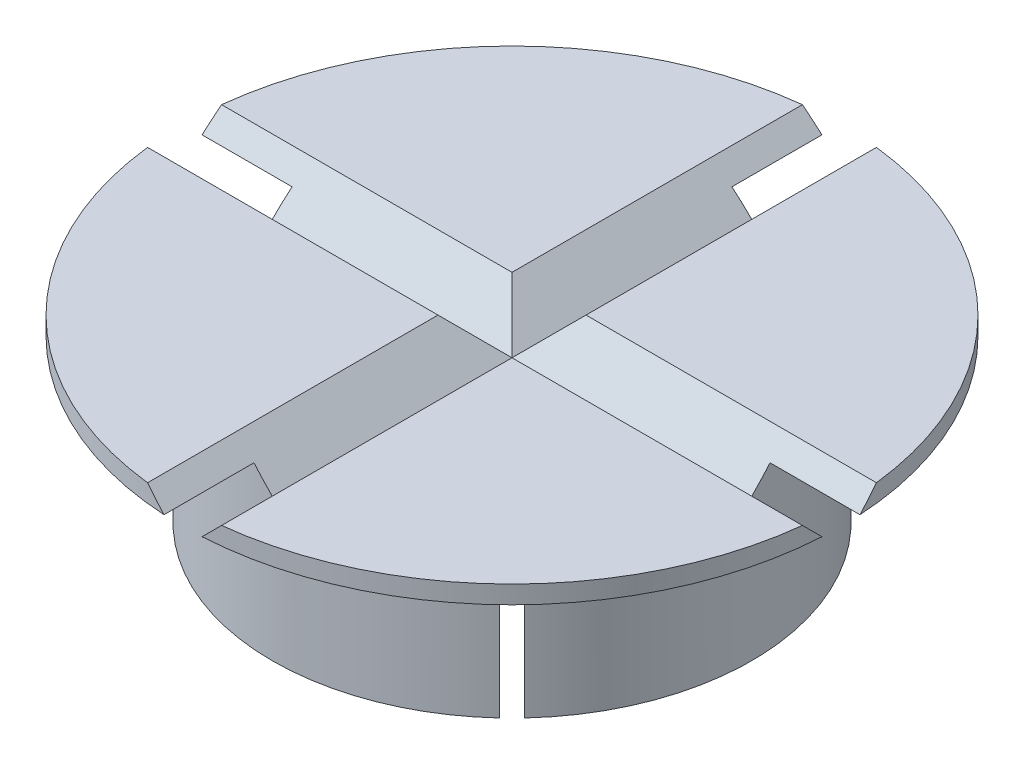
ISO-10303-21;
HEADER;
FILE_DESCRIPTION(('STEP AP214'),'2;1');
FILE_NAME('part.step','',(''),(''),'','','');
FILE_SCHEMA(('AUTOMOTIVE_DESIGN { 1 0 10303 214 1 1 1 1 }'));
ENDSEC;
DATA;
#1=APPLICATION_CONTEXT('core data for automotive mechanical design processes');
#2=APPLICATION_PROTOCOL_DEFINITION('international standard','automotive_design',2000,#1);
#3=PRODUCT_CONTEXT('',#1,'mechanical');
#4=PRODUCT('Part','Part','',(#3));
#5=PRODUCT_RELATED_PRODUCT_CATEGORY('part','',(#4));
#6=PRODUCT_DEFINITION_FORMATION('','',#4);
#7=PRODUCT_DEFINITION_CONTEXT('part definition',#1,'design');
#8=PRODUCT_DEFINITION('design','',#6,#7);
#9=PRODUCT_DEFINITION_SHAPE('','',#8);
#10=(LENGTH_UNIT() NAMED_UNIT(*) SI_UNIT(.MILLI.,.METRE.));
#11=(NAMED_UNIT(*) PLANE_ANGLE_UNIT() SI_UNIT($,.RADIAN.));
#12=(NAMED_UNIT(*) SI_UNIT($,.STERADIAN.) SOLID_ANGLE_UNIT());
#13=UNCERTAINTY_MEASURE_WITH_UNIT(LENGTH_MEASURE(1.E-05),#10,'distance_accuracy_value','');
#14=(GEOMETRIC_REPRESENTATION_CONTEXT(3) GLOBAL_UNCERTAINTY_ASSIGNED_CONTEXT((#13)) GLOBAL_UNIT_ASSIGNED_CONTEXT((#10,
#11,#12)) REPRESENTATION_CONTEXT('',''));
#15=CARTESIAN_POINT('',(0.,0.,0.));
#16=DIRECTION('',(0.,0.,1.));
#17=DIRECTION('',(1.,0.,0.));
#18=AXIS2_PLACEMENT_3D('',#15,#16,#17);
#19=CARTESIAN_POINT('',(0.,0.,0.));
#20=DIRECTION('',(0.,1.,0.));
#21=DIRECTION('',(0.,0.,1.));
#22=AXIS2_PLACEMENT_3D('',#19,#20,#21);
#23=PLANE('',#22);
#24=DIRECTION('',(-0.707106781186544,0.,0.707106781186551));
#25=VECTOR('',#24,1.);
#26=CARTESIAN_POINT('',(25.2340766922016,-3.2211462249284E-13,-26.6482902545749));
#27=LINE('',#26,#25);
#28=CARTESIAN_POINT('',(18.1593979295434,-2.36598536578077E-13,-19.5736114919167));
#29=VERTEX_POINT('',#28);
#30=CARTESIAN_POINT('',(16.0717862097112,-2.11364262460624E-13,-17.4859997720845));
#31=VERTEX_POINT('',#30);
#32=EDGE_CURVE('E266',#29,#31,#27,.T.);
#33=ORIENTED_EDGE('',*,*,#32,.T.);
#34=CARTESIAN_POINT('',(0.,0.,0.));
#35=DIRECTION('',(0.,-1.,0.));
#36=DIRECTION('',(0.,0.,-1.));
#37=AXIS2_PLACEMENT_3D('',#34,#35,#36);
#38=CIRCLE('',#37,23.75);
#39=CARTESIAN_POINT('',(-16.0717862097115,-2.02817018652179E-13,-17.4859997720841));
#40=VERTEX_POINT('',#39);
#41=EDGE_CURVE('E432',#40,#31,#38,.T.);
#42=ORIENTED_EDGE('',*,*,#41,.F.);
#43=DIRECTION('',(0.707106781186559,0.,0.707106781186536));
#44=VECTOR('',#43,1.);
#45=CARTESIAN_POINT('',(-25.2340766922021,-3.13567378684393E-13,-26.6482902545744));
#46=LINE('',#45,#44);
#47=CARTESIAN_POINT('',(-18.1593979295438,-2.28051292769631E-13,-19.5736114919163));
#48=VERTEX_POINT('',#47);
#49=EDGE_CURVE('E497',#48,#40,#46,.T.);
#50=ORIENTED_EDGE('',*,*,#49,.F.);
#51=CARTESIAN_POINT('',(0.,1.6306400674182E-13,0.));
#52=DIRECTION('',(0.,1.,0.));
#53=DIRECTION('',(0.,0.,1.));
#54=AXIS2_PLACEMENT_3D('',#51,#52,#53);
#55=CIRCLE('',#54,26.7);
#56=EDGE_CURVE('E275',#29,#48,#55,.T.);
#57=ORIENTED_EDGE('',*,*,#56,.F.);
#58=EDGE_LOOP('',(#33,#42,#50,#57));
#59=FACE_BOUND('',#58,.T.);
#60=ADVANCED_FACE('F37',(#59),#23,.F.);
#61=CARTESIAN_POINT('',(0.,20.,-1.20876281148109E-13));
#62=DIRECTION('',(0.,1.,0.));
#63=DIRECTION('',(0.,0.,1.));
#64=AXIS2_PLACEMENT_3D('',#61,#62,#63);
#65=CYLINDRICAL_SURFACE('',#64,26.6999999999999);
#66=CARTESIAN_POINT('',(0.,15.8786796564404,0.));
#67=DIRECTION('',(0.,-0.707106781186543,0.707106781186553));
#68=DIRECTION('',(0.,0.707106781186553,0.707106781186543));
#69=AXIS2_PLACEMENT_3D('',#66,#67,#68);
#70=ELLIPSE('',#69,37.7595021153616,26.6999999999999);
#71=CARTESIAN_POINT('',(-26.6155969311228,18.0000000000002,2.12132034355965));
#72=VERTEX_POINT('',#71);
#73=CARTESIAN_POINT('',(-26.6999999999999,15.8786796564405,0.));
#74=VERTEX_POINT('',#73);
#75=EDGE_CURVE('E399',#72,#74,#70,.T.);
#76=ORIENTED_EDGE('',*,*,#75,.T.);
#77=CARTESIAN_POINT('',(0.,15.8786796564404,0.));
#78=DIRECTION('',(0.,-0.707106781186551,-0.707106781186544));
#79=DIRECTION('',(0.,0.707106781186544,-0.707106781186551));
#80=AXIS2_PLACEMENT_3D('',#77,#78,#79);
#81=ELLIPSE('',#80,37.7595021153616,26.6999999999999);
#82=CARTESIAN_POINT('',(-26.6155969311228,18.0000000000002,-2.12132034355969));
#83=VERTEX_POINT('',#82);
#84=EDGE_CURVE('E392',#74,#83,#81,.T.);
#85=ORIENTED_EDGE('',*,*,#84,.T.);
#86=CARTESIAN_POINT('',(0.,18.0000000000002,-1.08788653033299E-13));
#87=DIRECTION('',(0.,1.,0.));
#88=DIRECTION('',(0.,0.,1.));
#89=AXIS2_PLACEMENT_3D('',#86,#87,#88);
#90=CIRCLE('',#89,26.6999999999999);
#91=CARTESIAN_POINT('',(-2.12132034355967,18.,-26.6155969311229));
#92=VERTEX_POINT('',#91);
#93=EDGE_CURVE('E289',#92,#83,#90,.T.);
#94=ORIENTED_EDGE('',*,*,#93,.F.);
#95=CARTESIAN_POINT('',(0.,15.8786796564404,0.));
#96=DIRECTION('',(-0.707106781186548,-0.707106781186547,0.));
#97=DIRECTION('',(-0.707106781186547,0.707106781186548,0.));
#98=AXIS2_PLACEMENT_3D('',#95,#96,#97);
#99=ELLIPSE('',#98,37.7595021153616,26.6999999999999);
#100=CARTESIAN_POINT('',(0.,15.8786796564404,-26.7));
#101=VERTEX_POINT('',#100);
#102=EDGE_CURVE('E360',#92,#101,#99,.T.);
#103=ORIENTED_EDGE('',*,*,#102,.T.);
#104=CARTESIAN_POINT('',(0.,15.8786796564404,0.));
#105=DIRECTION('',(0.707106781186548,-0.707106781186547,0.));
#106=DIRECTION('',(0.707106781186547,0.707106781186548,0.));
#107=AXIS2_PLACEMENT_3D('',#104,#105,#106);
#108=ELLIPSE('',#107,37.7595021153616,26.6999999999999);
#109=CARTESIAN_POINT('',(2.12132034355967,18.,-26.6155969311229));
#110=VERTEX_POINT('',#109);
#111=EDGE_CURVE('E344',#101,#110,#108,.T.);
#112=ORIENTED_EDGE('',*,*,#111,.T.);
#113=CARTESIAN_POINT('',(26.6155969311228,18.0000000000002,-2.12132034356019));
#114=VERTEX_POINT('',#113);
#115=EDGE_CURVE('E288',#114,#110,#90,.T.);
#116=ORIENTED_EDGE('',*,*,#115,.F.);
#117=CARTESIAN_POINT('',(0.,15.8786796564404,0.));
#118=DIRECTION('',(0.,-0.707106781186551,-0.707106781186544));
#119=DIRECTION('',(0.,0.707106781186544,-0.707106781186551));
#120=AXIS2_PLACEMENT_3D('',#117,#118,#119);
#121=ELLIPSE('',#120,37.7595021153616,26.6999999999999);
#122=CARTESIAN_POINT('',(26.6999999999999,15.8786796564402,-1.89190339067742E-13));
#123=VERTEX_POINT('',#122);
#124=EDGE_CURVE('E374',#114,#123,#121,.T.);
#125=ORIENTED_EDGE('',*,*,#124,.T.);
#126=CARTESIAN_POINT('',(0.,15.8786796564404,0.));
#127=DIRECTION('',(0.,-0.707106781186543,0.707106781186553));
#128=DIRECTION('',(0.,0.707106781186553,0.707106781186543));
#129=AXIS2_PLACEMENT_3D('',#126,#127,#128);
#130=ELLIPSE('',#129,37.7595021153616,26.6999999999999);
#131=CARTESIAN_POINT('',(26.6155969311228,18.0000000000002,2.12132034355979));
#132=VERTEX_POINT('',#131);
#133=EDGE_CURVE('E383',#123,#132,#130,.T.);
#134=ORIENTED_EDGE('',*,*,#133,.T.);
#135=CARTESIAN_POINT('',(2.12132034355999,18.0000000000003,26.6155969311227));
#136=VERTEX_POINT('',#135);
#137=EDGE_CURVE('E282',#136,#132,#90,.T.);
#138=ORIENTED_EDGE('',*,*,#137,.F.);
#139=CARTESIAN_POINT('',(0.,15.8786796564404,26.6999999999998));
#140=VERTEX_POINT('',#139);
#141=EDGE_CURVE('E336',#136,#140,#108,.T.);
#142=ORIENTED_EDGE('',*,*,#141,.T.);
#143=CARTESIAN_POINT('',(-2.12132034355999,18.0000000000003,26.6155969311227));
#144=VERTEX_POINT('',#143);
#145=EDGE_CURVE('E362',#140,#144,#99,.T.);
#146=ORIENTED_EDGE('',*,*,#145,.T.);
#147=EDGE_CURVE('E294',#72,#144,#90,.T.);
#148=ORIENTED_EDGE('',*,*,#147,.F.);
#149=EDGE_LOOP('',(#76,#85,#94,#103,#112,#116,#125,#134,#138,#142,#146,#148));
#150=FACE_BOUND('',#149,.T.);
#151=DIRECTION('',(0.,1.,0.));
#152=VECTOR('',#151,1.);
#153=CARTESIAN_POINT('',(18.1593979295433,19.9999999999999,-19.5736114919169));
#154=LINE('',#153,#152);
#155=CARTESIAN_POINT('',(18.1593979295434,11.9999999999998,-19.5736114919168));
#156=VERTEX_POINT('',#155);
#157=EDGE_CURVE('E503',#29,#156,#154,.T.);
#158=ORIENTED_EDGE('',*,*,#157,.F.);
#159=ORIENTED_EDGE('',*,*,#56,.T.);
#160=DIRECTION('',(0.,1.,0.));
#161=VECTOR('',#160,1.);
#162=CARTESIAN_POINT('',(-18.1593979295439,19.9999999999999,-19.5736114919164));
#163=LINE('',#162,#161);
#164=CARTESIAN_POINT('',(-18.1593979295438,11.9999999999998,-19.5736114919163));
#165=VERTEX_POINT('',#164);
#166=EDGE_CURVE('E468',#48,#165,#163,.T.);
#167=ORIENTED_EDGE('',*,*,#166,.T.);
#168=CARTESIAN_POINT('',(0.,12.,0.));
#169=DIRECTION('',(0.,-1.,0.));
#170=DIRECTION('',(1.,0.,0.));
#171=AXIS2_PLACEMENT_3D('',#168,#169,#170);
#172=CIRCLE('',#171,26.6999999999999);
#173=CARTESIAN_POINT('',(-19.5736114919169,11.9999999999998,-18.1593979295432));
#174=VERTEX_POINT('',#173);
#175=EDGE_CURVE('E457',#174,#165,#172,.T.);
#176=ORIENTED_EDGE('',*,*,#175,.F.);
#177=DIRECTION('',(0.,1.,0.));
#178=VECTOR('',#177,1.);
#179=CARTESIAN_POINT('',(-19.5736114919169,19.9999999999999,-18.1593979295432));
#180=LINE('',#179,#178);
#181=CARTESIAN_POINT('',(-19.5736114919169,-2.28051292769631E-13,-18.1593979295432));
#182=VERTEX_POINT('',#181);
#183=EDGE_CURVE('E464',#182,#174,#180,.T.);
#184=ORIENTED_EDGE('',*,*,#183,.F.);
#185=CARTESIAN_POINT('',(-19.5736114919165,0.,18.1593979295436));
#186=VERTEX_POINT('',#185);
#187=EDGE_CURVE('E277',#182,#186,#55,.T.);
#188=ORIENTED_EDGE('',*,*,#187,.T.);
#189=DIRECTION('',(0.,1.,0.));
#190=VECTOR('',#189,1.);
#191=CARTESIAN_POINT('',(-19.5736114919164,20.0000000000001,18.1593979295435));
#192=LINE('',#191,#190);
#193=CARTESIAN_POINT('',(-19.5736114919165,12.,18.1593979295436));
#194=VERTEX_POINT('',#193);
#195=EDGE_CURVE('E445',#186,#194,#192,.T.);
#196=ORIENTED_EDGE('',*,*,#195,.T.);
#197=CARTESIAN_POINT('',(0.,12.,0.));
#198=DIRECTION('',(0.,-1.,0.));
#199=DIRECTION('',(0.,0.,-1.));
#200=AXIS2_PLACEMENT_3D('',#197,#198,#199);
#201=CIRCLE('',#200,26.6999999999999);
#202=CARTESIAN_POINT('',(-18.1593979295434,12.,19.5736114919166));
#203=VERTEX_POINT('',#202);
#204=EDGE_CURVE('E437',#203,#194,#201,.T.);
#205=ORIENTED_EDGE('',*,*,#204,.F.);
#206=DIRECTION('',(0.,1.,0.));
#207=VECTOR('',#206,1.);
#208=CARTESIAN_POINT('',(-18.1593979295433,20.0000000000001,19.5736114919166));
#209=LINE('',#208,#207);
#210=CARTESIAN_POINT('',(-18.1593979295434,0.,19.5736114919167));
#211=VERTEX_POINT('',#210);
#212=EDGE_CURVE('E440',#211,#203,#209,.T.);
#213=ORIENTED_EDGE('',*,*,#212,.F.);
#214=CARTESIAN_POINT('',(18.1593979295437,0.,19.5736114919164));
#215=VERTEX_POINT('',#214);
#216=EDGE_CURVE('E274',#211,#215,#55,.T.);
#217=ORIENTED_EDGE('',*,*,#216,.T.);
#218=DIRECTION('',(0.,1.,0.));
#219=VECTOR('',#218,1.);
#220=CARTESIAN_POINT('',(18.1593979295437,20.0000000000001,19.5736114919162));
#221=LINE('',#220,#219);
#222=CARTESIAN_POINT('',(18.1593979295437,12.,19.5736114919163));
#223=VERTEX_POINT('',#222);
#224=EDGE_CURVE('E478',#215,#223,#221,.T.);
#225=ORIENTED_EDGE('',*,*,#224,.T.);
#226=CARTESIAN_POINT('',(0.,12.,0.));
#227=DIRECTION('',(0.,-1.,0.));
#228=DIRECTION('',(0.,0.,-1.));
#229=AXIS2_PLACEMENT_3D('',#226,#227,#228);
#230=CIRCLE('',#229,26.6999999999999);
#231=CARTESIAN_POINT('',(19.5736114919168,12.,18.1593979295432));
#232=VERTEX_POINT('',#231);
#233=EDGE_CURVE('E462',#232,#223,#230,.T.);
#234=ORIENTED_EDGE('',*,*,#233,.F.);
#235=DIRECTION('',(0.,1.,0.));
#236=VECTOR('',#235,1.);
#237=CARTESIAN_POINT('',(19.5736114919168,20.0000000000001,18.1593979295431));
#238=LINE('',#237,#236);
#239=CARTESIAN_POINT('',(19.5736114919167,0.,18.1593979295433));
#240=VERTEX_POINT('',#239);
#241=EDGE_CURVE('E273',#240,#232,#238,.T.);
#242=ORIENTED_EDGE('',*,*,#241,.F.);
#243=CARTESIAN_POINT('',(19.5736114919165,-2.19504048961189E-13,-18.1593979295436));
#244=VERTEX_POINT('',#243);
#245=EDGE_CURVE('E264',#240,#244,#55,.T.);
#246=ORIENTED_EDGE('',*,*,#245,.T.);
#247=DIRECTION('',(0.,1.,0.));
#248=VECTOR('',#247,1.);
#249=CARTESIAN_POINT('',(19.5736114919164,19.9999999999999,-18.1593979295438));
#250=LINE('',#249,#248);
#251=CARTESIAN_POINT('',(19.5736114919165,11.9999999999998,-18.1593979295437));
#252=VERTEX_POINT('',#251);
#253=EDGE_CURVE('E248',#244,#252,#250,.T.);
#254=ORIENTED_EDGE('',*,*,#253,.T.);
#255=CARTESIAN_POINT('',(0.,12.,0.));
#256=DIRECTION('',(0.,-1.,0.));
#257=DIRECTION('',(0.,0.,-1.));
#258=AXIS2_PLACEMENT_3D('',#255,#256,#257);
#259=CIRCLE('',#258,26.6999999999999);
#260=EDGE_CURVE('E499',#156,#252,#259,.T.);
#261=ORIENTED_EDGE('',*,*,#260,.F.);
#262=EDGE_LOOP('',(#158,#159,#167,#176,#184,#188,#196,#205,#213,#217,#225,#234,#242,#246,#254,#261));
#263=FACE_BOUND('',#262,.T.);
#264=ADVANCED_FACE('F271',(#150,#263),#65,.T.);
#265=CARTESIAN_POINT('',(0.,12.,0.));
#266=DIRECTION('',(0.,-1.,0.));
#267=DIRECTION('',(0.,0.,-1.));
#268=AXIS2_PLACEMENT_3D('',#265,#266,#267);
#269=CYLINDRICAL_SURFACE('',#268,23.75);
#270=DIRECTION('',(0.,-1.,0.));
#271=VECTOR('',#270,1.);
#272=CARTESIAN_POINT('',(16.0717862097112,11.9999999999999,-17.4859997720846));
#273=LINE('',#272,#271);
#274=CARTESIAN_POINT('',(16.0717862097112,11.9999999999998,-17.4859997720846));
#275=VERTEX_POINT('',#274);
#276=EDGE_CURVE('E256',#275,#31,#273,.T.);
#277=ORIENTED_EDGE('',*,*,#276,.F.);
#278=CARTESIAN_POINT('',(0.,12.,0.));
#279=DIRECTION('',(0.,-1.,0.));
#280=DIRECTION('',(0.,0.,-1.));
#281=AXIS2_PLACEMENT_3D('',#278,#279,#280);
#282=CIRCLE('',#281,23.75);
#283=CARTESIAN_POINT('',(-16.0717862097116,11.9999999999999,-17.4859997720842));
#284=VERTEX_POINT('',#283);
#285=EDGE_CURVE('E435',#284,#275,#282,.T.);
#286=ORIENTED_EDGE('',*,*,#285,.F.);
#287=DIRECTION('',(0.,-1.,0.));
#288=VECTOR('',#287,1.);
#289=CARTESIAN_POINT('',(-16.0717862097116,11.9999999999999,-17.4859997720842));
#290=LINE('',#289,#288);
#291=EDGE_CURVE('E471',#284,#40,#290,.T.);
#292=ORIENTED_EDGE('',*,*,#291,.T.);
#293=ORIENTED_EDGE('',*,*,#41,.T.);
#294=EDGE_LOOP('',(#277,#286,#292,#293));
#295=FACE_BOUND('',#294,.T.);
#296=ADVANCED_FACE('F541',(#295),#269,.F.);
#297=DIRECTION('',(0.707106781186559,0.,0.707106781186536));
#298=VECTOR('',#297,1.);
#299=CARTESIAN_POINT('',(-26.6482902545752,-3.13567378684393E-13,-25.2340766922013));
#300=LINE('',#299,#298);
#301=CARTESIAN_POINT('',(-17.4859997720846,-2.02817018652178E-13,-16.071786209711));
#302=VERTEX_POINT('',#301);
#303=EDGE_CURVE('E493',#182,#302,#300,.T.);
#304=ORIENTED_EDGE('',*,*,#303,.T.);
#305=CARTESIAN_POINT('',(-17.4859997720843,0.,16.0717862097114));
#306=VERTEX_POINT('',#305);
#307=EDGE_CURVE('E428',#306,#302,#38,.T.);
#308=ORIENTED_EDGE('',*,*,#307,.F.);
#309=DIRECTION('',(0.707106781186544,0.,-0.707106781186551));
#310=VECTOR('',#309,1.);
#311=CARTESIAN_POINT('',(-26.6482902545747,0.,25.2340766922018));
#312=LINE('',#311,#310);
#313=EDGE_CURVE('E455',#186,#306,#312,.T.);
#314=ORIENTED_EDGE('',*,*,#313,.F.);
#315=ORIENTED_EDGE('',*,*,#187,.F.);
#316=EDGE_LOOP('',(#304,#308,#314,#315));
#317=FACE_BOUND('',#316,.T.);
#318=ADVANCED_FACE('F536',(#317),#23,.F.);
#319=CARTESIAN_POINT('',(17.4859997720843,-1.94269774843737E-13,-16.0717862097114));
#320=VERTEX_POINT('',#319);
#321=CARTESIAN_POINT('',(17.4859997720845,0.,16.0717862097111));
#322=VERTEX_POINT('',#321);
#323=EDGE_CURVE('E265',#320,#322,#38,.T.);
#324=ORIENTED_EDGE('',*,*,#323,.F.);
#325=DIRECTION('',(-0.707106781186544,0.,0.707106781186551));
#326=VECTOR('',#325,1.);
#327=CARTESIAN_POINT('',(26.6482902545747,-3.05020134875953E-13,-25.2340766922018));
#328=LINE('',#327,#326);
#329=EDGE_CURVE('E251',#244,#320,#328,.T.);
#330=ORIENTED_EDGE('',*,*,#329,.F.);
#331=ORIENTED_EDGE('',*,*,#245,.F.);
#332=DIRECTION('',(-0.707106781186554,0.,-0.707106781186541));
#333=VECTOR('',#332,1.);
#334=CARTESIAN_POINT('',(26.648290254575,0.,25.2340766922015));
#335=LINE('',#334,#333);
#336=EDGE_CURVE('E485',#240,#322,#335,.T.);
#337=ORIENTED_EDGE('',*,*,#336,.T.);
#338=EDGE_LOOP('',(#324,#330,#331,#337));
#339=FACE_BOUND('',#338,.T.);
#340=ADVANCED_FACE('F262',(#339),#23,.F.);
#341=DIRECTION('',(0.,-1.,0.));
#342=VECTOR('',#341,1.);
#343=CARTESIAN_POINT('',(-17.4859997720846,11.9999999999999,-16.071786209711));
#344=LINE('',#343,#342);
#345=CARTESIAN_POINT('',(-17.4859997720847,11.9999999999998,-16.071786209711));
#346=VERTEX_POINT('',#345);
#347=EDGE_CURVE('E466',#346,#302,#344,.T.);
#348=ORIENTED_EDGE('',*,*,#347,.F.);
#349=CARTESIAN_POINT('',(-17.4859997720843,12.0000000000001,16.0717862097113));
#350=VERTEX_POINT('',#349);
#351=EDGE_CURVE('E427',#350,#346,#282,.T.);
#352=ORIENTED_EDGE('',*,*,#351,.F.);
#353=DIRECTION('',(0.,-1.,0.));
#354=VECTOR('',#353,1.);
#355=CARTESIAN_POINT('',(-17.4859997720843,12.0000000000001,16.0717862097113));
#356=LINE('',#355,#354);
#357=EDGE_CURVE('E447',#350,#306,#356,.T.);
#358=ORIENTED_EDGE('',*,*,#357,.T.);
#359=ORIENTED_EDGE('',*,*,#307,.T.);
#360=EDGE_LOOP('',(#348,#352,#358,#359));
#361=FACE_BOUND('',#360,.T.);
#362=ADVANCED_FACE('F556',(#361),#269,.F.);
#363=CARTESIAN_POINT('',(17.4859997720843,11.9999999999999,-16.0717862097115));
#364=VERTEX_POINT('',#363);
#365=CARTESIAN_POINT('',(17.4859997720845,12.,16.071786209711));
#366=VERTEX_POINT('',#365);
#367=EDGE_CURVE('E436',#364,#366,#282,.T.);
#368=ORIENTED_EDGE('',*,*,#367,.F.);
#369=DIRECTION('',(0.,-1.,0.));
#370=VECTOR('',#369,1.);
#371=CARTESIAN_POINT('',(17.4859997720843,11.9999999999999,-16.0717862097115));
#372=LINE('',#371,#370);
#373=EDGE_CURVE('E257',#364,#320,#372,.T.);
#374=ORIENTED_EDGE('',*,*,#373,.T.);
#375=ORIENTED_EDGE('',*,*,#323,.T.);
#376=DIRECTION('',(0.,-1.,0.));
#377=VECTOR('',#376,1.);
#378=CARTESIAN_POINT('',(17.4859997720845,12.0000000000001,16.071786209711));
#379=LINE('',#378,#377);
#380=EDGE_CURVE('E475',#366,#322,#379,.T.);
#381=ORIENTED_EDGE('',*,*,#380,.F.);
#382=EDGE_LOOP('',(#368,#374,#375,#381));
#383=FACE_BOUND('',#382,.T.);
#384=ADVANCED_FACE('F547',(#383),#269,.F.);
#385=CARTESIAN_POINT('',(16.0717862097114,0.,17.4859997720842));
#386=VERTEX_POINT('',#385);
#387=CARTESIAN_POINT('',(-16.0717862097112,0.,17.4859997720845));
#388=VERTEX_POINT('',#387);
#389=EDGE_CURVE('E439',#386,#388,#38,.T.);
#390=ORIENTED_EDGE('',*,*,#389,.F.);
#391=DIRECTION('',(-0.707106781186554,0.,-0.707106781186541));
#392=VECTOR('',#391,1.);
#393=CARTESIAN_POINT('',(25.2340766922019,0.,26.6482902545746));
#394=LINE('',#393,#392);
#395=EDGE_CURVE('E487',#215,#386,#394,.T.);
#396=ORIENTED_EDGE('',*,*,#395,.F.);
#397=ORIENTED_EDGE('',*,*,#216,.F.);
#398=DIRECTION('',(0.707106781186544,0.,-0.707106781186551));
#399=VECTOR('',#398,1.);
#400=CARTESIAN_POINT('',(-25.2340766922016,0.,26.6482902545749));
#401=LINE('',#400,#399);
#402=EDGE_CURVE('E451',#211,#388,#401,.T.);
#403=ORIENTED_EDGE('',*,*,#402,.T.);
#404=EDGE_LOOP('',(#390,#396,#397,#403));
#405=FACE_BOUND('',#404,.T.);
#406=ADVANCED_FACE('F537',(#405),#23,.F.);
#407=CARTESIAN_POINT('',(16.0717862097115,12.0000000000001,17.4859997720841));
#408=VERTEX_POINT('',#407);
#409=CARTESIAN_POINT('',(-16.0717862097112,12.,17.4859997720844));
#410=VERTEX_POINT('',#409);
#411=EDGE_CURVE('E431',#408,#410,#282,.T.);
#412=ORIENTED_EDGE('',*,*,#411,.F.);
#413=DIRECTION('',(0.,-1.,0.));
#414=VECTOR('',#413,1.);
#415=CARTESIAN_POINT('',(16.0717862097115,12.0000000000001,17.4859997720841));
#416=LINE('',#415,#414);
#417=EDGE_CURVE('E481',#408,#386,#416,.T.);
#418=ORIENTED_EDGE('',*,*,#417,.T.);
#419=ORIENTED_EDGE('',*,*,#389,.T.);
#420=DIRECTION('',(0.,-1.,0.));
#421=VECTOR('',#420,1.);
#422=CARTESIAN_POINT('',(-16.0717862097112,12.0000000000001,17.4859997720844));
#423=LINE('',#422,#421);
#424=EDGE_CURVE('E442',#410,#388,#423,.T.);
#425=ORIENTED_EDGE('',*,*,#424,.F.);
#426=EDGE_LOOP('',(#412,#418,#419,#425));
#427=FACE_BOUND('',#426,.T.);
#428=ADVANCED_FACE('F546',(#427),#269,.F.);
#429=CARTESIAN_POINT('',(0.,18.,-26.7));
#430=DIRECTION('',(0.,1.,0.));
#431=DIRECTION('',(0.,0.,1.));
#432=AXIS2_PLACEMENT_3D('',#429,#430,#431);
#433=PLANE('',#432);
#434=CARTESIAN_POINT('',(0.,18.0000000000002,-1.08788653033299E-13));
#435=DIRECTION('',(0.,1.,0.));
#436=DIRECTION('',(0.,0.,1.));
#437=AXIS2_PLACEMENT_3D('',#434,#435,#436);
#438=CIRCLE('',#437,36.6999999999999);
#439=CARTESIAN_POINT('',(36.6386408044839,18.0000000000002,-2.12132034356032));
#440=VERTEX_POINT('',#439);
#441=CARTESIAN_POINT('',(2.12132034355964,18.,-36.638640804484));
#442=VERTEX_POINT('',#441);
#443=EDGE_CURVE('E308',#440,#442,#438,.T.);
#444=ORIENTED_EDGE('',*,*,#443,.F.);
#445=DIRECTION('',(-1.,0.,0.));
#446=VECTOR('',#445,1.);
#447=CARTESIAN_POINT('',(2.34364970973921E-13,18.0000000000002,-2.12132034355994));
#448=LINE('',#447,#446);
#449=EDGE_CURVE('E377',#440,#114,#448,.T.);
#450=ORIENTED_EDGE('',*,*,#449,.T.);
#451=ORIENTED_EDGE('',*,*,#115,.T.);
#452=DIRECTION('',(0.,0.,-1.));
#453=VECTOR('',#452,1.);
#454=CARTESIAN_POINT('',(2.12132034355967,18.,-26.7));
#455=LINE('',#454,#453);
#456=EDGE_CURVE('E349',#110,#442,#455,.T.);
#457=ORIENTED_EDGE('',*,*,#456,.T.);
#458=EDGE_LOOP('',(#444,#450,#451,#457));
#459=FACE_BOUND('',#458,.T.);
#460=ADVANCED_FACE('F553',(#459),#433,.F.);
#461=CARTESIAN_POINT('',(0.,20.,-1.20876281148109E-13));
#462=DIRECTION('',(0.,1.,0.));
#463=DIRECTION('',(0.,0.,1.));
#464=AXIS2_PLACEMENT_3D('',#461,#462,#463);
#465=CYLINDRICAL_SURFACE('',#464,36.6999999999999);
#466=CARTESIAN_POINT('',(0.,20.0000000000002,-1.2087628114811E-13));
#467=DIRECTION('',(0.,1.,0.));
#468=DIRECTION('',(0.,0.,1.));
#469=AXIS2_PLACEMENT_3D('',#466,#467,#468);
#470=CIRCLE('',#469,36.6999999999999);
#471=CARTESIAN_POINT('',(-36.4678587063424,20.0000000000002,4.12132034355964));
#472=VERTEX_POINT('',#471);
#473=CARTESIAN_POINT('',(-4.12132034355963,20.,36.4678587063422));
#474=VERTEX_POINT('',#473);
#475=EDGE_CURVE('E330',#472,#474,#470,.T.);
#476=ORIENTED_EDGE('',*,*,#475,.F.);
#477=CARTESIAN_POINT('',(0.,15.8786796564404,0.));
#478=DIRECTION('',(0.,-0.707106781186543,0.707106781186553));
#479=DIRECTION('',(0.,0.707106781186553,0.707106781186543));
#480=AXIS2_PLACEMENT_3D('',#477,#478,#479);
#481=ELLIPSE('',#480,51.9016377390925,36.6999999999999);
#482=CARTESIAN_POINT('',(-36.6386408044839,18.0000000000002,2.12132034355963));
#483=VERTEX_POINT('',#482);
#484=EDGE_CURVE('E397',#472,#483,#481,.T.);
#485=ORIENTED_EDGE('',*,*,#484,.T.);
#486=CARTESIAN_POINT('',(-2.12132034356008,18.0000000000005,36.6386408044837));
#487=VERTEX_POINT('',#486);
#488=EDGE_CURVE('E314',#483,#487,#438,.T.);
#489=ORIENTED_EDGE('',*,*,#488,.T.);
#490=CARTESIAN_POINT('',(0.,15.8786796564404,0.));
#491=DIRECTION('',(-0.707106781186548,-0.707106781186547,0.));
#492=DIRECTION('',(-0.707106781186547,0.707106781186548,0.));
#493=AXIS2_PLACEMENT_3D('',#490,#491,#492);
#494=ELLIPSE('',#493,51.9016377390925,36.6999999999999);
#495=EDGE_CURVE('E367',#487,#474,#494,.T.);
#496=ORIENTED_EDGE('',*,*,#495,.T.);
#497=EDGE_LOOP('',(#476,#485,#489,#496));
#498=FACE_BOUND('',#497,.T.);
#499=ADVANCED_FACE('F868',(#498),#465,.T.);
#500=CARTESIAN_POINT('',(0.,19.9999999999999,-36.7));
#501=DIRECTION('',(0.,-1.,0.));
#502=DIRECTION('',(0.,0.,-1.));
#503=AXIS2_PLACEMENT_3D('',#500,#501,#502);
#504=PLANE('',#503);
#505=DIRECTION('',(0.,0.,1.));
#506=VECTOR('',#505,1.);
#507=CARTESIAN_POINT('',(4.12132034355953,19.9999999999999,-36.7));
#508=LINE('',#507,#506);
#509=CARTESIAN_POINT('',(4.12132034355963,20.,-36.4678587063425));
#510=VERTEX_POINT('',#509);
#511=CARTESIAN_POINT('',(4.12132034355967,20.,-4.12132034355979));
#512=VERTEX_POINT('',#511);
#513=EDGE_CURVE('E658',#510,#512,#508,.T.);
#514=ORIENTED_EDGE('',*,*,#513,.T.);
#515=DIRECTION('',(1.,0.,0.));
#516=VECTOR('',#515,1.);
#517=CARTESIAN_POINT('',(-36.7,20.0000000000002,-4.12132034355962));
#518=LINE('',#517,#516);
#519=CARTESIAN_POINT('',(36.4678587063424,19.9999999999998,-4.12132034355988));
#520=VERTEX_POINT('',#519);
#521=EDGE_CURVE('E412',#512,#520,#518,.T.);
#522=ORIENTED_EDGE('',*,*,#521,.T.);
#523=EDGE_CURVE('E328',#520,#510,#470,.T.);
#524=ORIENTED_EDGE('',*,*,#523,.T.);
#525=EDGE_LOOP('',(#514,#522,#524));
#526=FACE_BOUND('',#525,.T.);
#527=ADVANCED_FACE('F856',(#526),#504,.F.);
#528=ORIENTED_EDGE('',*,*,#93,.T.);
#529=DIRECTION('',(-1.,0.,0.));
#530=VECTOR('',#529,1.);
#531=CARTESIAN_POINT('',(2.34364970973921E-13,18.0000000000002,-2.12132034355994));
#532=LINE('',#531,#530);
#533=CARTESIAN_POINT('',(-36.6386408044839,18.0000000000002,-2.12132034355959));
#534=VERTEX_POINT('',#533);
#535=EDGE_CURVE('E395',#83,#534,#532,.T.);
#536=ORIENTED_EDGE('',*,*,#535,.T.);
#537=CARTESIAN_POINT('',(-2.12132034355964,18.,-36.638640804484));
#538=VERTEX_POINT('',#537);
#539=EDGE_CURVE('E309',#538,#534,#438,.T.);
#540=ORIENTED_EDGE('',*,*,#539,.F.);
#541=DIRECTION('',(0.,0.,1.));
#542=VECTOR('',#541,1.);
#543=CARTESIAN_POINT('',(-2.12132034355967,18.,-26.7));
#544=LINE('',#543,#542);
#545=EDGE_CURVE('E368',#538,#92,#544,.T.);
#546=ORIENTED_EDGE('',*,*,#545,.T.);
#547=EDGE_LOOP('',(#528,#536,#540,#546));
#548=FACE_BOUND('',#547,.T.);
#549=ADVANCED_FACE('F900',(#548),#433,.F.);
#550=ORIENTED_EDGE('',*,*,#523,.F.);
#551=CARTESIAN_POINT('',(0.,15.8786796564404,0.));
#552=DIRECTION('',(0.,-0.707106781186551,-0.707106781186544));
#553=DIRECTION('',(0.,0.707106781186544,-0.707106781186551));
#554=AXIS2_PLACEMENT_3D('',#551,#552,#553);
#555=ELLIPSE('',#554,51.9016377390925,36.6999999999999);
#556=EDGE_CURVE('E380',#520,#440,#555,.T.);
#557=ORIENTED_EDGE('',*,*,#556,.T.);
#558=ORIENTED_EDGE('',*,*,#443,.T.);
#559=CARTESIAN_POINT('',(0.,15.8786796564404,0.));
#560=DIRECTION('',(0.707106781186548,-0.707106781186547,0.));
#561=DIRECTION('',(0.707106781186547,0.707106781186548,0.));
#562=AXIS2_PLACEMENT_3D('',#559,#560,#561);
#563=ELLIPSE('',#562,51.9016377390925,36.6999999999999);
#564=EDGE_CURVE('E354',#442,#510,#563,.T.);
#565=ORIENTED_EDGE('',*,*,#564,.T.);
#566=EDGE_LOOP('',(#550,#557,#558,#565));
#567=FACE_BOUND('',#566,.T.);
#568=ADVANCED_FACE('F893',(#567),#465,.T.);
#569=CARTESIAN_POINT('',(-4.12132034355953,20.,-36.4678587063425));
#570=VERTEX_POINT('',#569);
#571=CARTESIAN_POINT('',(-36.4678587063424,20.0000000000002,-4.12132034355962));
#572=VERTEX_POINT('',#571);
#573=EDGE_CURVE('E329',#570,#572,#470,.T.);
#574=ORIENTED_EDGE('',*,*,#573,.T.);
#575=CARTESIAN_POINT('',(-4.12132034355963,20.,-4.12132034355971));
#576=VERTEX_POINT('',#575);
#577=EDGE_CURVE('E404',#572,#576,#518,.T.);
#578=ORIENTED_EDGE('',*,*,#577,.T.);
#579=DIRECTION('',(0.,0.,-1.));
#580=VECTOR('',#579,1.);
#581=CARTESIAN_POINT('',(-4.12132034355953,19.9999999999999,-36.7));
#582=LINE('',#581,#580);
#583=EDGE_CURVE('E279',#576,#570,#582,.T.);
#584=ORIENTED_EDGE('',*,*,#583,.T.);
#585=EDGE_LOOP('',(#574,#578,#584));
#586=FACE_BOUND('',#585,.T.);
#587=ADVANCED_FACE('F885',(#586),#504,.F.);
#588=CARTESIAN_POINT('',(4.12132034355963,20.,-36.7));
#589=DIRECTION('',(0.707106781186548,-0.707106781186547,0.));
#590=DIRECTION('',(0.707106781186547,0.707106781186548,0.));
#591=AXIS2_PLACEMENT_3D('',#588,#589,#590);
#592=PLANE('',#591);
#593=DIRECTION('',(0.,0.,1.));
#594=VECTOR('',#593,1.);
#595=CARTESIAN_POINT('',(0.,15.8786796564404,-36.7));
#596=LINE('',#595,#594);
#597=CARTESIAN_POINT('',(0.,15.8786796564404,0.));
#598=VERTEX_POINT('',#597);
#599=EDGE_CURVE('E370',#101,#598,#596,.T.);
#600=ORIENTED_EDGE('',*,*,#599,.T.);
#601=DIRECTION('',(0.577350269189627,0.577350269189621,-0.577350269189629));
#602=VECTOR('',#601,1.);
#603=CARTESIAN_POINT('',(-12.2128802681613,3.66579938827923,12.2128802681612));
#604=LINE('',#603,#602);
#605=EDGE_CURVE('E418',#598,#512,#604,.T.);
#606=ORIENTED_EDGE('',*,*,#605,.T.);
#607=ORIENTED_EDGE('',*,*,#513,.F.);
#608=ORIENTED_EDGE('',*,*,#564,.F.);
#609=ORIENTED_EDGE('',*,*,#456,.F.);
#610=ORIENTED_EDGE('',*,*,#111,.F.);
#611=EDGE_LOOP('',(#600,#606,#607,#608,#609,#610));
#612=FACE_BOUND('',#611,.T.);
#613=ADVANCED_FACE('F845',(#612),#592,.F.);
#614=CARTESIAN_POINT('',(0.,15.8786796564404,-36.7));
#615=DIRECTION('',(-0.707106781186548,-0.707106781186547,0.));
#616=DIRECTION('',(0.707106781186547,-0.707106781186548,0.));
#617=AXIS2_PLACEMENT_3D('',#614,#615,#616);
#618=PLANE('',#617);
#619=ORIENTED_EDGE('',*,*,#583,.F.);
#620=DIRECTION('',(0.577350269189628,-0.577350269189623,0.577350269189626));
#621=VECTOR('',#620,1.);
#622=CARTESIAN_POINT('',(9.46533337245476,6.41334628398569,9.46533337245462));
#623=LINE('',#622,#621);
#624=EDGE_CURVE('E424',#576,#598,#623,.T.);
#625=ORIENTED_EDGE('',*,*,#624,.T.);
#626=ORIENTED_EDGE('',*,*,#599,.F.);
#627=ORIENTED_EDGE('',*,*,#102,.F.);
#628=ORIENTED_EDGE('',*,*,#545,.F.);
#629=EDGE_CURVE('E364',#570,#538,#494,.T.);
#630=ORIENTED_EDGE('',*,*,#629,.F.);
#631=EDGE_LOOP('',(#619,#625,#626,#627,#628,#630));
#632=FACE_BOUND('',#631,.T.);
#633=ADVANCED_FACE('F833',(#632),#618,.F.);
#634=ORIENTED_EDGE('',*,*,#137,.T.);
#635=DIRECTION('',(1.,0.,0.));
#636=VECTOR('',#635,1.);
#637=CARTESIAN_POINT('',(0.,18.0000000000002,2.12132034355972));
#638=LINE('',#637,#636);
#639=CARTESIAN_POINT('',(36.6386408044839,18.0000000000002,2.12132034355985));
#640=VERTEX_POINT('',#639);
#641=EDGE_CURVE('E386',#132,#640,#638,.T.);
#642=ORIENTED_EDGE('',*,*,#641,.T.);
#643=CARTESIAN_POINT('',(2.12132034356008,18.0000000000005,36.6386408044838));
#644=VERTEX_POINT('',#643);
#645=EDGE_CURVE('E301',#644,#640,#438,.T.);
#646=ORIENTED_EDGE('',*,*,#645,.F.);
#647=EDGE_CURVE('E343',#644,#136,#455,.T.);
#648=ORIENTED_EDGE('',*,*,#647,.T.);
#649=EDGE_LOOP('',(#634,#642,#646,#648));
#650=FACE_BOUND('',#649,.T.);
#651=ADVANCED_FACE('F878',(#650),#433,.F.);
#652=ORIENTED_EDGE('',*,*,#539,.T.);
#653=CARTESIAN_POINT('',(0.,15.8786796564404,0.));
#654=DIRECTION('',(0.,-0.707106781186551,-0.707106781186544));
#655=DIRECTION('',(0.,0.707106781186544,-0.707106781186551));
#656=AXIS2_PLACEMENT_3D('',#653,#654,#655);
#657=ELLIPSE('',#656,51.9016377390925,36.6999999999999);
#658=EDGE_CURVE('E390',#534,#572,#657,.T.);
#659=ORIENTED_EDGE('',*,*,#658,.T.);
#660=ORIENTED_EDGE('',*,*,#573,.F.);
#661=ORIENTED_EDGE('',*,*,#629,.T.);
#662=EDGE_LOOP('',(#652,#659,#660,#661));
#663=FACE_BOUND('',#662,.T.);
#664=ADVANCED_FACE('F869',(#663),#465,.T.);
#665=CARTESIAN_POINT('',(4.12132034355963,20.,36.4678587063422));
#666=VERTEX_POINT('',#665);
#667=CARTESIAN_POINT('',(36.4678587063424,19.9999999999998,4.12132034355938));
#668=VERTEX_POINT('',#667);
#669=EDGE_CURVE('E321',#666,#668,#470,.T.);
#670=ORIENTED_EDGE('',*,*,#669,.T.);
#671=DIRECTION('',(1.,0.,0.));
#672=VECTOR('',#671,1.);
#673=CARTESIAN_POINT('',(-36.7,20.0000000000002,4.12132034355964));
#674=LINE('',#673,#672);
#675=CARTESIAN_POINT('',(4.12132034355963,20.,4.1213203435595));
#676=VERTEX_POINT('',#675);
#677=EDGE_CURVE('E408',#676,#668,#674,.T.);
#678=ORIENTED_EDGE('',*,*,#677,.F.);
#679=EDGE_CURVE('E664',#676,#666,#508,.T.);
#680=ORIENTED_EDGE('',*,*,#679,.T.);
#681=EDGE_LOOP('',(#670,#678,#680));
#682=FACE_BOUND('',#681,.T.);
#683=ADVANCED_FACE('F857',(#682),#504,.F.);
#684=ORIENTED_EDGE('',*,*,#488,.F.);
#685=DIRECTION('',(1.,0.,0.));
#686=VECTOR('',#685,1.);
#687=CARTESIAN_POINT('',(0.,18.0000000000002,2.12132034355972));
#688=LINE('',#687,#686);
#689=EDGE_CURVE('E402',#483,#72,#688,.T.);
#690=ORIENTED_EDGE('',*,*,#689,.T.);
#691=ORIENTED_EDGE('',*,*,#147,.T.);
#692=EDGE_CURVE('E365',#144,#487,#544,.T.);
#693=ORIENTED_EDGE('',*,*,#692,.T.);
#694=EDGE_LOOP('',(#684,#690,#691,#693));
#695=FACE_BOUND('',#694,.T.);
#696=ADVANCED_FACE('F866',(#695),#433,.F.);
#697=ORIENTED_EDGE('',*,*,#645,.T.);
#698=CARTESIAN_POINT('',(0.,15.8786796564404,0.));
#699=DIRECTION('',(0.,-0.707106781186543,0.707106781186553));
#700=DIRECTION('',(0.,0.707106781186553,0.707106781186543));
#701=AXIS2_PLACEMENT_3D('',#698,#699,#700);
#702=ELLIPSE('',#701,51.9016377390925,36.6999999999999);
#703=EDGE_CURVE('E388',#640,#668,#702,.T.);
#704=ORIENTED_EDGE('',*,*,#703,.T.);
#705=ORIENTED_EDGE('',*,*,#669,.F.);
#706=EDGE_CURVE('E347',#666,#644,#563,.T.);
#707=ORIENTED_EDGE('',*,*,#706,.T.);
#708=EDGE_LOOP('',(#697,#704,#705,#707));
#709=FACE_BOUND('',#708,.T.);
#710=ADVANCED_FACE('F854',(#709),#465,.T.);
#711=CARTESIAN_POINT('',(-4.12132034355978,20.0000000000001,4.12132034355958));
#712=VERTEX_POINT('',#711);
#713=EDGE_CURVE('E977',#474,#712,#582,.T.);
#714=ORIENTED_EDGE('',*,*,#713,.T.);
#715=EDGE_CURVE('E405',#472,#712,#674,.T.);
#716=ORIENTED_EDGE('',*,*,#715,.F.);
#717=ORIENTED_EDGE('',*,*,#475,.T.);
#718=EDGE_LOOP('',(#714,#716,#717));
#719=FACE_BOUND('',#718,.T.);
#720=ADVANCED_FACE('F842',(#719),#504,.F.);
#721=ORIENTED_EDGE('',*,*,#679,.F.);
#722=DIRECTION('',(-0.577350269189626,-0.577350269189635,-0.577350269189617));
#723=VECTOR('',#722,1.);
#724=CARTESIAN_POINT('',(12.2128802681613,28.0915599246018,12.212880268161));
#725=LINE('',#724,#723);
#726=EDGE_CURVE('E415',#676,#598,#725,.T.);
#727=ORIENTED_EDGE('',*,*,#726,.T.);
#728=EDGE_CURVE('E373',#598,#140,#596,.T.);
#729=ORIENTED_EDGE('',*,*,#728,.T.);
#730=ORIENTED_EDGE('',*,*,#141,.F.);
#731=ORIENTED_EDGE('',*,*,#647,.F.);
#732=ORIENTED_EDGE('',*,*,#706,.F.);
#733=EDGE_LOOP('',(#721,#727,#729,#730,#731,#732));
#734=FACE_BOUND('',#733,.T.);
#735=ADVANCED_FACE('F830',(#734),#592,.F.);
#736=ORIENTED_EDGE('',*,*,#728,.F.);
#737=DIRECTION('',(-0.57735026918962,0.577350269189628,0.577350269189629));
#738=VECTOR('',#737,1.);
#739=CARTESIAN_POINT('',(-14.9604271638678,30.8391068203083,14.9604271638679));
#740=LINE('',#739,#738);
#741=EDGE_CURVE('E421',#598,#712,#740,.T.);
#742=ORIENTED_EDGE('',*,*,#741,.T.);
#743=ORIENTED_EDGE('',*,*,#713,.F.);
#744=ORIENTED_EDGE('',*,*,#495,.F.);
#745=ORIENTED_EDGE('',*,*,#692,.F.);
#746=ORIENTED_EDGE('',*,*,#145,.F.);
#747=EDGE_LOOP('',(#736,#742,#743,#744,#745,#746));
#748=FACE_BOUND('',#747,.T.);
#749=ADVANCED_FACE('F820',(#748),#618,.F.);
#750=CARTESIAN_POINT('',(-36.7,15.8786796564406,0.));
#751=DIRECTION('',(0.,-0.707106781186543,0.707106781186553));
#752=DIRECTION('',(0.,-0.707106781186553,-0.707106781186543));
#753=AXIS2_PLACEMENT_3D('',#750,#751,#752);
#754=PLANE('',#753);
#755=ORIENTED_EDGE('',*,*,#715,.T.);
#756=ORIENTED_EDGE('',*,*,#741,.F.);
#757=DIRECTION('',(1.,0.,0.));
#758=VECTOR('',#757,1.);
#759=CARTESIAN_POINT('',(-36.7,15.8786796564406,0.));
#760=LINE('',#759,#758);
#761=EDGE_CURVE('E409',#74,#598,#760,.T.);
#762=ORIENTED_EDGE('',*,*,#761,.F.);
#763=ORIENTED_EDGE('',*,*,#75,.F.);
#764=ORIENTED_EDGE('',*,*,#689,.F.);
#765=ORIENTED_EDGE('',*,*,#484,.F.);
#766=EDGE_LOOP('',(#755,#756,#762,#763,#764,#765));
#767=FACE_BOUND('',#766,.T.);
#768=ADVANCED_FACE('F643',(#767),#754,.F.);
#769=CARTESIAN_POINT('',(-36.7,20.0000000000002,-4.12132034355962));
#770=DIRECTION('',(0.,-0.707106781186551,-0.707106781186544));
#771=DIRECTION('',(0.,0.707106781186544,-0.707106781186551));
#772=AXIS2_PLACEMENT_3D('',#769,#770,#771);
#773=PLANE('',#772);
#774=ORIENTED_EDGE('',*,*,#535,.F.);
#775=ORIENTED_EDGE('',*,*,#84,.F.);
#776=ORIENTED_EDGE('',*,*,#761,.T.);
#777=ORIENTED_EDGE('',*,*,#624,.F.);
#778=ORIENTED_EDGE('',*,*,#577,.F.);
#779=ORIENTED_EDGE('',*,*,#658,.F.);
#780=EDGE_LOOP('',(#774,#775,#776,#777,#778,#779));
#781=FACE_BOUND('',#780,.T.);
#782=ADVANCED_FACE('F803',(#781),#773,.F.);
#783=ORIENTED_EDGE('',*,*,#449,.F.);
#784=ORIENTED_EDGE('',*,*,#556,.F.);
#785=ORIENTED_EDGE('',*,*,#521,.F.);
#786=ORIENTED_EDGE('',*,*,#605,.F.);
#787=EDGE_CURVE('E407',#598,#123,#760,.T.);
#788=ORIENTED_EDGE('',*,*,#787,.T.);
#789=ORIENTED_EDGE('',*,*,#124,.F.);
#790=EDGE_LOOP('',(#783,#784,#785,#786,#788,#789));
#791=FACE_BOUND('',#790,.T.);
#792=ADVANCED_FACE('F640',(#791),#773,.F.);
#793=ORIENTED_EDGE('',*,*,#787,.F.);
#794=ORIENTED_EDGE('',*,*,#726,.F.);
#795=ORIENTED_EDGE('',*,*,#677,.T.);
#796=ORIENTED_EDGE('',*,*,#703,.F.);
#797=ORIENTED_EDGE('',*,*,#641,.F.);
#798=ORIENTED_EDGE('',*,*,#133,.F.);
#799=EDGE_LOOP('',(#793,#794,#795,#796,#797,#798));
#800=FACE_BOUND('',#799,.T.);
#801=ADVANCED_FACE('F634',(#800),#754,.F.);
#802=CARTESIAN_POINT('',(0.,12.,0.));
#803=DIRECTION('',(0.,-1.,0.));
#804=DIRECTION('',(0.,0.,-1.));
#805=AXIS2_PLACEMENT_3D('',#802,#803,#804);
#806=PLANE('',#805);
#807=CARTESIAN_POINT('',(0.,12.,0.));
#808=DIRECTION('',(0.,-1.,0.));
#809=DIRECTION('',(0.,0.,-1.));
#810=AXIS2_PLACEMENT_3D('',#807,#808,#809);
#811=CIRCLE('',#810,9.99999999999996);
#812=CARTESIAN_POINT('',(0.,11.9999999999999,-10.));
#813=VERTEX_POINT('',#812);
#814=EDGE_CURVE('E11',#813,#813,#811,.F.);
#815=ORIENTED_EDGE('',*,*,#814,.T.);
#816=EDGE_LOOP('',(#815));
#817=FACE_BOUND('',#816,.T.);
#818=ORIENTED_EDGE('',*,*,#285,.T.);
#819=DIRECTION('',(-0.707106781186544,0.,0.707106781186551));
#820=VECTOR('',#819,1.);
#821=CARTESIAN_POINT('',(25.2340766922016,11.9999999999997,-26.6482902545751));
#822=LINE('',#821,#820);
#823=EDGE_CURVE('E507',#156,#275,#822,.T.);
#824=ORIENTED_EDGE('',*,*,#823,.F.);
#825=ORIENTED_EDGE('',*,*,#260,.T.);
#826=DIRECTION('',(-0.707106781186544,0.,0.707106781186551));
#827=VECTOR('',#826,1.);
#828=CARTESIAN_POINT('',(26.6482902545747,11.9999999999997,-25.234076692202));
#829=LINE('',#828,#827);
#830=EDGE_CURVE('E53',#252,#364,#829,.T.);
#831=ORIENTED_EDGE('',*,*,#830,.T.);
#832=ORIENTED_EDGE('',*,*,#367,.T.);
#833=DIRECTION('',(-0.707106781186554,0.,-0.707106781186541));
#834=VECTOR('',#833,1.);
#835=CARTESIAN_POINT('',(26.6482902545751,12.,25.2340766922014));
#836=LINE('',#835,#834);
#837=EDGE_CURVE('E484',#232,#366,#836,.T.);
#838=ORIENTED_EDGE('',*,*,#837,.F.);
#839=ORIENTED_EDGE('',*,*,#233,.T.);
#840=DIRECTION('',(-0.707106781186554,0.,-0.707106781186541));
#841=VECTOR('',#840,1.);
#842=CARTESIAN_POINT('',(25.234076692202,12.,26.6482902545745));
#843=LINE('',#842,#841);
#844=EDGE_CURVE('E60',#223,#408,#843,.T.);
#845=ORIENTED_EDGE('',*,*,#844,.T.);
#846=ORIENTED_EDGE('',*,*,#411,.T.);
#847=DIRECTION('',(0.707106781186544,0.,-0.707106781186551));
#848=VECTOR('',#847,1.);
#849=CARTESIAN_POINT('',(-25.2340766922016,12.,26.6482902545749));
#850=LINE('',#849,#848);
#851=EDGE_CURVE('E450',#203,#410,#850,.T.);
#852=ORIENTED_EDGE('',*,*,#851,.F.);
#853=ORIENTED_EDGE('',*,*,#204,.T.);
#854=DIRECTION('',(0.707106781186544,0.,-0.707106781186551));
#855=VECTOR('',#854,1.);
#856=CARTESIAN_POINT('',(-26.6482902545747,12.,25.2340766922018));
#857=LINE('',#856,#855);
#858=EDGE_CURVE('E454',#194,#350,#857,.T.);
#859=ORIENTED_EDGE('',*,*,#858,.T.);
#860=ORIENTED_EDGE('',*,*,#351,.T.);
#861=DIRECTION('',(0.707106781186559,0.,0.707106781186536));
#862=VECTOR('',#861,1.);
#863=CARTESIAN_POINT('',(-26.6482902545753,11.9999999999997,-25.2340766922014));
#864=LINE('',#863,#862);
#865=EDGE_CURVE('E489',#174,#346,#864,.T.);
#866=ORIENTED_EDGE('',*,*,#865,.F.);
#867=ORIENTED_EDGE('',*,*,#175,.T.);
#868=DIRECTION('',(0.707106781186559,0.,0.707106781186536));
#869=VECTOR('',#868,1.);
#870=CARTESIAN_POINT('',(-25.2340766922022,11.9999999999997,-26.6482902545745));
#871=LINE('',#870,#869);
#872=EDGE_CURVE('E496',#165,#284,#871,.T.);
#873=ORIENTED_EDGE('',*,*,#872,.T.);
#874=EDGE_LOOP('',(#818,#824,#825,#831,#832,#838,#839,#845,#846,#852,#853,#859,#860,#866,#867,#873));
#875=FACE_BOUND('',#874,.T.);
#876=ADVANCED_FACE('F580',(#817,#875),#806,.T.);
#877=CARTESIAN_POINT('',(-25.2340766922016,12.,26.6482902545749));
#878=DIRECTION('',(-0.707106781186551,0.,-0.707106781186544));
#879=DIRECTION('',(-0.707106781186544,0.,0.707106781186551));
#880=AXIS2_PLACEMENT_3D('',#877,#878,#879);
#881=PLANE('',#880);
#882=ORIENTED_EDGE('',*,*,#212,.T.);
#883=ORIENTED_EDGE('',*,*,#851,.T.);
#884=ORIENTED_EDGE('',*,*,#424,.T.);
#885=ORIENTED_EDGE('',*,*,#402,.F.);
#886=EDGE_LOOP('',(#882,#883,#884,#885));
#887=FACE_BOUND('',#886,.T.);
#888=ADVANCED_FACE('F588',(#887),#881,.T.);
#889=CARTESIAN_POINT('',(-26.6482902545747,12.,25.2340766922018));
#890=DIRECTION('',(-0.707106781186551,0.,-0.707106781186544));
#891=DIRECTION('',(-0.707106781186544,0.,0.707106781186551));
#892=AXIS2_PLACEMENT_3D('',#889,#890,#891);
#893=PLANE('',#892);
#894=ORIENTED_EDGE('',*,*,#313,.T.);
#895=ORIENTED_EDGE('',*,*,#357,.F.);
#896=ORIENTED_EDGE('',*,*,#858,.F.);
#897=ORIENTED_EDGE('',*,*,#195,.F.);
#898=EDGE_LOOP('',(#894,#895,#896,#897));
#899=FACE_BOUND('',#898,.T.);
#900=ADVANCED_FACE('F602',(#899),#893,.F.);
#901=CARTESIAN_POINT('',(26.6482902545751,12.,25.2340766922014));
#902=DIRECTION('',(-0.707106781186541,0.,0.707106781186554));
#903=DIRECTION('',(0.707106781186554,0.,0.707106781186541));
#904=AXIS2_PLACEMENT_3D('',#901,#902,#903);
#905=PLANE('',#904);
#906=ORIENTED_EDGE('',*,*,#241,.T.);
#907=ORIENTED_EDGE('',*,*,#837,.T.);
#908=ORIENTED_EDGE('',*,*,#380,.T.);
#909=ORIENTED_EDGE('',*,*,#336,.F.);
#910=EDGE_LOOP('',(#906,#907,#908,#909));
#911=FACE_BOUND('',#910,.T.);
#912=ADVANCED_FACE('F594',(#911),#905,.T.);
#913=CARTESIAN_POINT('',(25.234076692202,12.,26.6482902545745));
#914=DIRECTION('',(-0.707106781186541,0.,0.707106781186554));
#915=DIRECTION('',(0.707106781186554,0.,0.707106781186541));
#916=AXIS2_PLACEMENT_3D('',#913,#914,#915);
#917=PLANE('',#916);
#918=ORIENTED_EDGE('',*,*,#395,.T.);
#919=ORIENTED_EDGE('',*,*,#417,.F.);
#920=ORIENTED_EDGE('',*,*,#844,.F.);
#921=ORIENTED_EDGE('',*,*,#224,.F.);
#922=EDGE_LOOP('',(#918,#919,#920,#921));
#923=FACE_BOUND('',#922,.T.);
#924=ADVANCED_FACE('F598',(#923),#917,.F.);
#925=CARTESIAN_POINT('',(-26.6482902545753,11.9999999999997,-25.2340766922014));
#926=DIRECTION('',(0.707106781186536,0.,-0.707106781186559));
#927=DIRECTION('',(-0.707106781186559,0.,-0.707106781186536));
#928=AXIS2_PLACEMENT_3D('',#925,#926,#927);
#929=PLANE('',#928);
#930=ORIENTED_EDGE('',*,*,#183,.T.);
#931=ORIENTED_EDGE('',*,*,#865,.T.);
#932=ORIENTED_EDGE('',*,*,#347,.T.);
#933=ORIENTED_EDGE('',*,*,#303,.F.);
#934=EDGE_LOOP('',(#930,#931,#932,#933));
#935=FACE_BOUND('',#934,.T.);
#936=ADVANCED_FACE('F621',(#935),#929,.T.);
#937=CARTESIAN_POINT('',(-25.2340766922022,11.9999999999997,-26.6482902545745));
#938=DIRECTION('',(0.707106781186536,0.,-0.707106781186559));
#939=DIRECTION('',(-0.707106781186559,0.,-0.707106781186536));
#940=AXIS2_PLACEMENT_3D('',#937,#938,#939);
#941=PLANE('',#940);
#942=ORIENTED_EDGE('',*,*,#49,.T.);
#943=ORIENTED_EDGE('',*,*,#291,.F.);
#944=ORIENTED_EDGE('',*,*,#872,.F.);
#945=ORIENTED_EDGE('',*,*,#166,.F.);
#946=EDGE_LOOP('',(#942,#943,#944,#945));
#947=FACE_BOUND('',#946,.T.);
#948=ADVANCED_FACE('F613',(#947),#941,.F.);
#949=CARTESIAN_POINT('',(25.2340766922016,11.9999999999997,-26.6482902545751));
#950=DIRECTION('',(0.707106781186551,0.,0.707106781186544));
#951=DIRECTION('',(0.707106781186544,0.,-0.707106781186551));
#952=AXIS2_PLACEMENT_3D('',#949,#950,#951);
#953=PLANE('',#952);
#954=ORIENTED_EDGE('',*,*,#157,.T.);
#955=ORIENTED_EDGE('',*,*,#823,.T.);
#956=ORIENTED_EDGE('',*,*,#276,.T.);
#957=ORIENTED_EDGE('',*,*,#32,.F.);
#958=EDGE_LOOP('',(#954,#955,#956,#957));
#959=FACE_BOUND('',#958,.T.);
#960=ADVANCED_FACE('F614',(#959),#953,.T.);
#961=CARTESIAN_POINT('',(26.6482902545747,11.9999999999997,-25.234076692202));
#962=DIRECTION('',(0.707106781186551,0.,0.707106781186544));
#963=DIRECTION('',(0.707106781186544,0.,-0.707106781186551));
#964=AXIS2_PLACEMENT_3D('',#961,#962,#963);
#965=PLANE('',#964);
#966=ORIENTED_EDGE('',*,*,#329,.T.);
#967=ORIENTED_EDGE('',*,*,#373,.F.);
#968=ORIENTED_EDGE('',*,*,#830,.F.);
#969=ORIENTED_EDGE('',*,*,#253,.F.);
#970=EDGE_LOOP('',(#966,#967,#968,#969));
#971=FACE_BOUND('',#970,.T.);
#972=ADVANCED_FACE('F250',(#971),#965,.F.);
#973=CARTESIAN_POINT('',(0.,-2.,0.));
#974=DIRECTION('',(0.,-1.,0.));
#975=DIRECTION('',(0.,0.,-1.));
#976=AXIS2_PLACEMENT_3D('',#973,#974,#975);
#977=PLANE('',#976);
#978=CARTESIAN_POINT('',(0.,-2.,0.));
#979=DIRECTION('',(0.,-1.,0.));
#980=DIRECTION('',(0.,0.,-1.));
#981=AXIS2_PLACEMENT_3D('',#978,#979,#980);
#982=CIRCLE('',#981,3.34999999999999);
#983=CARTESIAN_POINT('',(0.,-2.00000000000002,-3.34999999999997));
#984=VERTEX_POINT('',#983);
#985=EDGE_CURVE('E661',#984,#984,#982,.F.);
#986=ORIENTED_EDGE('',*,*,#985,.T.);
#987=EDGE_LOOP('',(#986));
#988=FACE_BOUND('',#987,.T.);
#989=CARTESIAN_POINT('',(0.,-2.,0.));
#990=DIRECTION('',(0.,-1.,0.));
#991=DIRECTION('',(0.,0.,-1.));
#992=AXIS2_PLACEMENT_3D('',#989,#990,#991);
#993=CIRCLE('',#992,5.);
#994=CARTESIAN_POINT('',(0.,-2.00000000000003,-4.99999999999999));
#995=VERTEX_POINT('',#994);
#996=EDGE_CURVE('E267',#995,#995,#993,.T.);
#997=ORIENTED_EDGE('',*,*,#996,.T.);
#998=EDGE_LOOP('',(#997));
#999=FACE_BOUND('',#998,.T.);
#1000=ADVANCED_FACE('F515',(#988,#999),#977,.T.);
#1001=CARTESIAN_POINT('',(0.,-2.,0.));
#1002=DIRECTION('',(0.,1.,0.));
#1003=DIRECTION('',(0.,0.,1.));
#1004=AXIS2_PLACEMENT_3D('',#1001,#1002,#1003);
#1005=CYLINDRICAL_SURFACE('',#1004,5.);
#1006=CARTESIAN_POINT('',(0.,6.99999999999999,0.));
#1007=DIRECTION('',(0.,-1.,0.));
#1008=DIRECTION('',(0.,0.,-1.));
#1009=AXIS2_PLACEMENT_3D('',#1006,#1007,#1008);
#1010=CIRCLE('',#1009,5.);
#1011=CARTESIAN_POINT('',(0.,6.99999999999995,-5.00000000000004));
#1012=VERTEX_POINT('',#1011);
#1013=EDGE_CURVE('E46',#1012,#1012,#1010,.T.);
#1014=ORIENTED_EDGE('',*,*,#1013,.T.);
#1015=EDGE_LOOP('',(#1014));
#1016=FACE_BOUND('',#1015,.T.);
#1017=ORIENTED_EDGE('',*,*,#996,.F.);
#1018=EDGE_LOOP('',(#1017));
#1019=FACE_BOUND('',#1018,.T.);
#1020=ADVANCED_FACE('F517',(#1016,#1019),#1005,.T.);
#1021=CARTESIAN_POINT('',(0.,-2.,0.));
#1022=DIRECTION('',(0.,1.,0.));
#1023=DIRECTION('',(0.,0.,1.));
#1024=AXIS2_PLACEMENT_3D('',#1021,#1022,#1023);
#1025=CYLINDRICAL_SURFACE('',#1024,2.35);
#1026=CARTESIAN_POINT('',(0.,-1.00000000000002,0.));
#1027=DIRECTION('',(0.,-1.,0.));
#1028=DIRECTION('',(0.,0.,-1.));
#1029=AXIS2_PLACEMENT_3D('',#1026,#1027,#1028);
#1030=CIRCLE('',#1029,2.35);
#1031=CARTESIAN_POINT('',(0.,-1.00000000000003,-2.34999999999999));
#1032=VERTEX_POINT('',#1031);
#1033=EDGE_CURVE('E657',#1032,#1032,#1030,.T.);
#1034=ORIENTED_EDGE('',*,*,#1033,.T.);
#1035=EDGE_LOOP('',(#1034));
#1036=FACE_BOUND('',#1035,.T.);
#1037=CARTESIAN_POINT('',(0.,12.,0.));
#1038=DIRECTION('',(0.,-1.,0.));
#1039=DIRECTION('',(0.,0.,-1.));
#1040=AXIS2_PLACEMENT_3D('',#1037,#1038,#1039);
#1041=CIRCLE('',#1040,2.35);
#1042=CARTESIAN_POINT('',(0.,12.,-2.35000000000007));
#1043=VERTEX_POINT('',#1042);
#1044=EDGE_CURVE('E655',#1043,#1043,#1041,.F.);
#1045=ORIENTED_EDGE('',*,*,#1044,.T.);
#1046=EDGE_LOOP('',(#1045));
#1047=FACE_BOUND('',#1046,.T.);
#1048=ADVANCED_FACE('F519',(#1036,#1047),#1025,.F.);
#1049=ORIENTED_EDGE('',*,*,#1044,.F.);
#1050=EDGE_LOOP('',(#1049));
#1051=FACE_BOUND('',#1050,.T.);
#1052=ADVANCED_FACE('F526',(#1051),#806,.T.);
#1053=CARTESIAN_POINT('',(0.,-1.00000000000002,0.));
#1054=DIRECTION('',(0.,-1.,0.));
#1055=DIRECTION('',(0.,0.,-1.));
#1056=AXIS2_PLACEMENT_3D('',#1053,#1054,#1055);
#1057=CONICAL_SURFACE('',#1056,2.35,0.785398163397451);
#1058=ORIENTED_EDGE('',*,*,#985,.F.);
#1059=EDGE_LOOP('',(#1058));
#1060=FACE_BOUND('',#1059,.T.);
#1061=ORIENTED_EDGE('',*,*,#1033,.F.);
#1062=EDGE_LOOP('',(#1061));
#1063=FACE_BOUND('',#1062,.T.);
#1064=ADVANCED_FACE('F645',(#1060,#1063),#1057,.F.);
#1065=CARTESIAN_POINT('',(0.,6.99999999999999,0.));
#1066=DIRECTION('',(0.,1.,0.));
#1067=DIRECTION('',(0.,0.,1.));
#1068=AXIS2_PLACEMENT_3D('',#1065,#1066,#1067);
#1069=CONICAL_SURFACE('',#1068,5.,0.785398163397443);
#1070=ORIENTED_EDGE('',*,*,#814,.F.);
#1071=EDGE_LOOP('',(#1070));
#1072=FACE_BOUND('',#1071,.T.);
#1073=ORIENTED_EDGE('',*,*,#1013,.F.);
#1074=EDGE_LOOP('',(#1073));
#1075=FACE_BOUND('',#1074,.T.);
#1076=ADVANCED_FACE('F40',(#1072,#1075),#1069,.T.);
#1077=CLOSED_SHELL('',(#60,#264,#296,#318,#340,#362,#384,#406,#428,#460,#499,#527,#549,#568,
#587,#613,#633,#651,#664,#683,#696,#710,#720,#735,#749,#768,#782,#792,#801,#876,#888,#900,#912,
#924,#936,#948,#960,#972,#1000,#1020,#1048,#1052,#1064,#1076));
#1078=MANIFOLD_SOLID_BREP('B2',#1077);
#1079=ADVANCED_BREP_SHAPE_REPRESENTATION('',(#18,#1078),#14);
#1080=SHAPE_DEFINITION_REPRESENTATION(#9,#1079);
ENDSEC;
END-ISO-10303-21;
